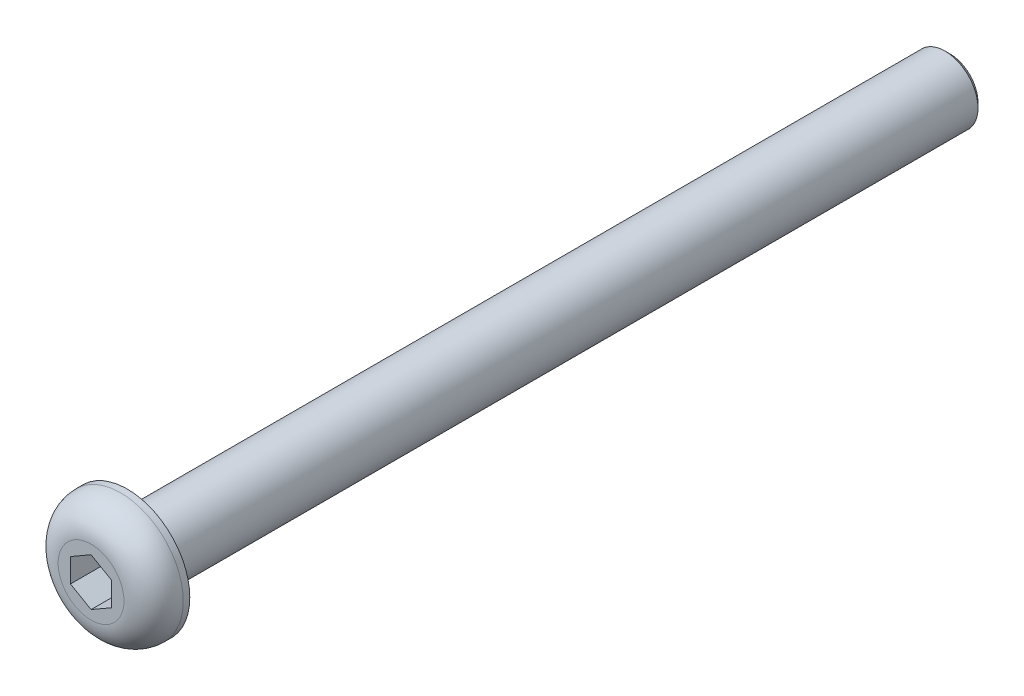
ISO-10303-21;
HEADER;
FILE_DESCRIPTION(('STEP AP214'),'2;1');
FILE_NAME('part.step','',(''),(''),'','','');
FILE_SCHEMA(('AUTOMOTIVE_DESIGN { 1 0 10303 214 1 1 1 1 }'));
ENDSEC;
DATA;
#1=APPLICATION_CONTEXT('core data for automotive mechanical design processes');
#2=APPLICATION_PROTOCOL_DEFINITION('international standard','automotive_design',2000,#1);
#3=PRODUCT_CONTEXT('',#1,'mechanical');
#4=PRODUCT('Part','Part','',(#3));
#5=PRODUCT_RELATED_PRODUCT_CATEGORY('part','',(#4));
#6=PRODUCT_DEFINITION_FORMATION('','',#4);
#7=PRODUCT_DEFINITION_CONTEXT('part definition',#1,'design');
#8=PRODUCT_DEFINITION('design','',#6,#7);
#9=PRODUCT_DEFINITION_SHAPE('','',#8);
#10=(LENGTH_UNIT() NAMED_UNIT(*) SI_UNIT(.MILLI.,.METRE.));
#11=(NAMED_UNIT(*) PLANE_ANGLE_UNIT() SI_UNIT($,.RADIAN.));
#12=(NAMED_UNIT(*) SI_UNIT($,.STERADIAN.) SOLID_ANGLE_UNIT());
#13=UNCERTAINTY_MEASURE_WITH_UNIT(LENGTH_MEASURE(1.E-05),#10,'distance_accuracy_value','');
#14=(GEOMETRIC_REPRESENTATION_CONTEXT(3) GLOBAL_UNCERTAINTY_ASSIGNED_CONTEXT((#13)) GLOBAL_UNIT_ASSIGNED_CONTEXT((#10,
#11,#12)) REPRESENTATION_CONTEXT('',''));
#15=CARTESIAN_POINT('',(0.,0.,0.));
#16=DIRECTION('',(0.,0.,1.));
#17=DIRECTION('',(1.,0.,0.));
#18=AXIS2_PLACEMENT_3D('',#15,#16,#17);
#19=CARTESIAN_POINT('',(0.,0.,0.));
#20=DIRECTION('',(0.,0.,1.));
#21=DIRECTION('',(1.,0.,0.));
#22=AXIS2_PLACEMENT_3D('',#19,#20,#21);
#23=PLANE('',#22);
#24=CARTESIAN_POINT('',(0.,0.,0.));
#25=DIRECTION('',(0.,0.,1.));
#26=DIRECTION('',(1.,0.,0.));
#27=AXIS2_PLACEMENT_3D('',#24,#25,#26);
#28=CIRCLE('',#27,3.8);
#29=CARTESIAN_POINT('',(3.8,0.,0.));
#30=VERTEX_POINT('',#29);
#31=EDGE_CURVE('E138',#30,#30,#28,.T.);
#32=ORIENTED_EDGE('',*,*,#31,.F.);
#33=EDGE_LOOP('',(#32));
#34=FACE_BOUND('',#33,.T.);
#35=CARTESIAN_POINT('',(0.,0.,0.));
#36=DIRECTION('',(0.,0.,1.));
#37=DIRECTION('',(1.,0.,0.));
#38=AXIS2_PLACEMENT_3D('',#35,#36,#37);
#39=CIRCLE('',#38,2.);
#40=CARTESIAN_POINT('',(2.,0.,0.));
#41=VERTEX_POINT('',#40);
#42=EDGE_CURVE('E146',#41,#41,#39,.F.);
#43=ORIENTED_EDGE('',*,*,#42,.F.);
#44=EDGE_LOOP('',(#43));
#45=FACE_BOUND('',#44,.T.);
#46=ADVANCED_FACE('F36',(#34,#45),#23,.F.);
#47=CARTESIAN_POINT('',(0.,0.,2.2));
#48=DIRECTION('',(0.,0.,-1.));
#49=DIRECTION('',(-1.,0.,0.));
#50=AXIS2_PLACEMENT_3D('',#47,#48,#49);
#51=CYLINDRICAL_SURFACE('',#50,3.8);
#52=CARTESIAN_POINT('',(0.,0.,0.4));
#53=DIRECTION('',(0.,0.,1.));
#54=DIRECTION('',(1.,0.,0.));
#55=AXIS2_PLACEMENT_3D('',#52,#53,#54);
#56=CIRCLE('',#55,3.8);
#57=CARTESIAN_POINT('',(3.8,0.,0.4));
#58=VERTEX_POINT('',#57);
#59=EDGE_CURVE('E11',#58,#58,#56,.F.);
#60=ORIENTED_EDGE('',*,*,#59,.T.);
#61=EDGE_LOOP('',(#60));
#62=FACE_BOUND('',#61,.T.);
#63=ORIENTED_EDGE('',*,*,#31,.T.);
#64=EDGE_LOOP('',(#63));
#65=FACE_BOUND('',#64,.T.);
#66=ADVANCED_FACE('F169',(#62,#65),#51,.T.);
#67=CARTESIAN_POINT('',(0.,0.,2.2));
#68=DIRECTION('',(0.,0.,1.));
#69=DIRECTION('',(1.,0.,0.));
#70=AXIS2_PLACEMENT_3D('',#67,#68,#69);
#71=PLANE('',#70);
#72=CARTESIAN_POINT('',(0.,0.,2.2));
#73=DIRECTION('',(0.,0.,1.));
#74=DIRECTION('',(1.,0.,0.));
#75=AXIS2_PLACEMENT_3D('',#72,#73,#74);
#76=CIRCLE('',#75,2.);
#77=CARTESIAN_POINT('',(2.,0.,2.2));
#78=VERTEX_POINT('',#77);
#79=EDGE_CURVE('E44',#78,#78,#76,.T.);
#80=ORIENTED_EDGE('',*,*,#79,.T.);
#81=EDGE_LOOP('',(#80));
#82=FACE_BOUND('',#81,.T.);
#83=DIRECTION('',(-0.866025403784439,0.5,0.));
#84=VECTOR('',#83,1.);
#85=CARTESIAN_POINT('',(1.25,0.721687836487033,2.2));
#86=LINE('',#85,#84);
#87=CARTESIAN_POINT('',(1.25,0.721687836487033,2.2));
#88=VERTEX_POINT('',#87);
#89=CARTESIAN_POINT('',(0.,1.44337567297406,2.2));
#90=VERTEX_POINT('',#89);
#91=EDGE_CURVE('E51',#88,#90,#86,.T.);
#92=ORIENTED_EDGE('',*,*,#91,.F.);
#93=DIRECTION('',(0.,1.,0.));
#94=VECTOR('',#93,1.);
#95=CARTESIAN_POINT('',(1.25,-0.721687836487033,2.2));
#96=LINE('',#95,#94);
#97=CARTESIAN_POINT('',(1.25,-0.721687836487033,2.2));
#98=VERTEX_POINT('',#97);
#99=EDGE_CURVE('E134',#98,#88,#96,.T.);
#100=ORIENTED_EDGE('',*,*,#99,.F.);
#101=DIRECTION('',(0.866025403784439,0.5,0.));
#102=VECTOR('',#101,1.);
#103=CARTESIAN_POINT('',(0.,-1.44337567297406,2.2));
#104=LINE('',#103,#102);
#105=CARTESIAN_POINT('',(0.,-1.44337567297406,2.2));
#106=VERTEX_POINT('',#105);
#107=EDGE_CURVE('E132',#106,#98,#104,.T.);
#108=ORIENTED_EDGE('',*,*,#107,.F.);
#109=DIRECTION('',(0.866025403784439,-0.5,0.));
#110=VECTOR('',#109,1.);
#111=CARTESIAN_POINT('',(-1.25,-0.721687836487032,2.2));
#112=LINE('',#111,#110);
#113=CARTESIAN_POINT('',(-1.25,-0.721687836487032,2.2));
#114=VERTEX_POINT('',#113);
#115=EDGE_CURVE('E99',#114,#106,#112,.T.);
#116=ORIENTED_EDGE('',*,*,#115,.F.);
#117=DIRECTION('',(0.,-1.,0.));
#118=VECTOR('',#117,1.);
#119=CARTESIAN_POINT('',(-1.25,0.721687836487033,2.2));
#120=LINE('',#119,#118);
#121=CARTESIAN_POINT('',(-1.25,0.721687836487033,2.2));
#122=VERTEX_POINT('',#121);
#123=EDGE_CURVE('E128',#122,#114,#120,.T.);
#124=ORIENTED_EDGE('',*,*,#123,.F.);
#125=DIRECTION('',(-0.866025403784439,-0.5,0.));
#126=VECTOR('',#125,1.);
#127=CARTESIAN_POINT('',(0.,1.44337567297406,2.2));
#128=LINE('',#127,#126);
#129=EDGE_CURVE('E125',#90,#122,#128,.T.);
#130=ORIENTED_EDGE('',*,*,#129,.F.);
#131=EDGE_LOOP('',(#92,#100,#108,#116,#124,#130));
#132=FACE_BOUND('',#131,.T.);
#133=ADVANCED_FACE('F157',(#82,#132),#71,.T.);
#134=CARTESIAN_POINT('',(0.,0.,-50.));
#135=DIRECTION('',(0.,0.,1.));
#136=DIRECTION('',(1.,0.,0.));
#137=AXIS2_PLACEMENT_3D('',#134,#135,#136);
#138=CYLINDRICAL_SURFACE('',#137,2.);
#139=CARTESIAN_POINT('',(0.,0.,-49.7));
#140=DIRECTION('',(0.,0.,-1.));
#141=DIRECTION('',(-1.,0.,0.));
#142=AXIS2_PLACEMENT_3D('',#139,#140,#141);
#143=CIRCLE('',#142,2.);
#144=CARTESIAN_POINT('',(-2.,0.,-49.7));
#145=VERTEX_POINT('',#144);
#146=EDGE_CURVE('E152',#145,#145,#143,.F.);
#147=ORIENTED_EDGE('',*,*,#146,.T.);
#148=EDGE_LOOP('',(#147));
#149=FACE_BOUND('',#148,.T.);
#150=ORIENTED_EDGE('',*,*,#42,.T.);
#151=EDGE_LOOP('',(#150));
#152=FACE_BOUND('',#151,.T.);
#153=ADVANCED_FACE('F192',(#149,#152),#138,.T.);
#154=CARTESIAN_POINT('',(0.,0.,-50.));
#155=DIRECTION('',(0.,0.,-1.));
#156=DIRECTION('',(-1.,0.,0.));
#157=AXIS2_PLACEMENT_3D('',#154,#155,#156);
#158=PLANE('',#157);
#159=CARTESIAN_POINT('',(0.,0.,-50.));
#160=DIRECTION('',(0.,0.,-1.));
#161=DIRECTION('',(-1.,0.,0.));
#162=AXIS2_PLACEMENT_3D('',#159,#160,#161);
#163=CIRCLE('',#162,1.7);
#164=CARTESIAN_POINT('',(-1.7,0.,-50.));
#165=VERTEX_POINT('',#164);
#166=EDGE_CURVE('E149',#165,#165,#163,.T.);
#167=ORIENTED_EDGE('',*,*,#166,.T.);
#168=EDGE_LOOP('',(#167));
#169=FACE_BOUND('',#168,.T.);
#170=ADVANCED_FACE('F184',(#169),#158,.T.);
#171=CARTESIAN_POINT('',(0.,0.,-50.));
#172=DIRECTION('',(0.,0.,1.));
#173=DIRECTION('',(1.,0.,0.));
#174=AXIS2_PLACEMENT_3D('',#171,#172,#173);
#175=CONICAL_SURFACE('',#174,1.7,0.785398163397457);
#176=ORIENTED_EDGE('',*,*,#146,.F.);
#177=EDGE_LOOP('',(#176));
#178=FACE_BOUND('',#177,.T.);
#179=ORIENTED_EDGE('',*,*,#166,.F.);
#180=EDGE_LOOP('',(#179));
#181=FACE_BOUND('',#180,.T.);
#182=ADVANCED_FACE('F181',(#178,#181),#175,.T.);
#183=CARTESIAN_POINT('',(1.25,0.721687836487033,0.2));
#184=DIRECTION('',(0.5,0.866025403784439,0.));
#185=DIRECTION('',(-0.866025403784439,0.5,0.));
#186=AXIS2_PLACEMENT_3D('',#183,#184,#185);
#187=PLANE('',#186);
#188=ORIENTED_EDGE('',*,*,#91,.T.);
#189=DIRECTION('',(0.,0.,1.));
#190=VECTOR('',#189,1.);
#191=CARTESIAN_POINT('',(0.,1.44337567297406,0.2));
#192=LINE('',#191,#190);
#193=CARTESIAN_POINT('',(0.,1.44337567297406,0.2));
#194=VERTEX_POINT('',#193);
#195=EDGE_CURVE('E81',#194,#90,#192,.T.);
#196=ORIENTED_EDGE('',*,*,#195,.F.);
#197=DIRECTION('',(-0.866025403784439,0.5,0.));
#198=VECTOR('',#197,1.);
#199=CARTESIAN_POINT('',(1.25,0.721687836487033,0.2));
#200=LINE('',#199,#198);
#201=CARTESIAN_POINT('',(1.25,0.721687836487033,0.2));
#202=VERTEX_POINT('',#201);
#203=EDGE_CURVE('E136',#202,#194,#200,.T.);
#204=ORIENTED_EDGE('',*,*,#203,.F.);
#205=DIRECTION('',(0.,0.,1.));
#206=VECTOR('',#205,1.);
#207=CARTESIAN_POINT('',(1.25,0.721687836487033,0.2));
#208=LINE('',#207,#206);
#209=EDGE_CURVE('E59',#202,#88,#208,.T.);
#210=ORIENTED_EDGE('',*,*,#209,.T.);
#211=EDGE_LOOP('',(#188,#196,#204,#210));
#212=FACE_BOUND('',#211,.T.);
#213=ADVANCED_FACE('F183',(#212),#187,.F.);
#214=CARTESIAN_POINT('',(1.25,-0.721687836487033,0.2));
#215=DIRECTION('',(1.,0.,0.));
#216=DIRECTION('',(0.,1.,0.));
#217=AXIS2_PLACEMENT_3D('',#214,#215,#216);
#218=PLANE('',#217);
#219=ORIENTED_EDGE('',*,*,#99,.T.);
#220=ORIENTED_EDGE('',*,*,#209,.F.);
#221=DIRECTION('',(0.,1.,0.));
#222=VECTOR('',#221,1.);
#223=CARTESIAN_POINT('',(1.25,-0.721687836487033,0.2));
#224=LINE('',#223,#222);
#225=CARTESIAN_POINT('',(1.25,-0.721687836487033,0.2));
#226=VERTEX_POINT('',#225);
#227=EDGE_CURVE('E111',#226,#202,#224,.T.);
#228=ORIENTED_EDGE('',*,*,#227,.F.);
#229=DIRECTION('',(0.,0.,1.));
#230=VECTOR('',#229,1.);
#231=CARTESIAN_POINT('',(1.25,-0.721687836487033,0.2));
#232=LINE('',#231,#230);
#233=EDGE_CURVE('E103',#226,#98,#232,.T.);
#234=ORIENTED_EDGE('',*,*,#233,.T.);
#235=EDGE_LOOP('',(#219,#220,#228,#234));
#236=FACE_BOUND('',#235,.T.);
#237=ADVANCED_FACE('F190',(#236),#218,.F.);
#238=CARTESIAN_POINT('',(0.,-1.44337567297406,0.2));
#239=DIRECTION('',(0.5,-0.866025403784439,0.));
#240=DIRECTION('',(0.866025403784439,0.5,0.));
#241=AXIS2_PLACEMENT_3D('',#238,#239,#240);
#242=PLANE('',#241);
#243=ORIENTED_EDGE('',*,*,#107,.T.);
#244=ORIENTED_EDGE('',*,*,#233,.F.);
#245=DIRECTION('',(0.866025403784439,0.5,0.));
#246=VECTOR('',#245,1.);
#247=CARTESIAN_POINT('',(0.,-1.44337567297406,0.2));
#248=LINE('',#247,#246);
#249=CARTESIAN_POINT('',(0.,-1.44337567297406,0.2));
#250=VERTEX_POINT('',#249);
#251=EDGE_CURVE('E107',#250,#226,#248,.T.);
#252=ORIENTED_EDGE('',*,*,#251,.F.);
#253=DIRECTION('',(0.,0.,1.));
#254=VECTOR('',#253,1.);
#255=CARTESIAN_POINT('',(0.,-1.44337567297406,0.2));
#256=LINE('',#255,#254);
#257=EDGE_CURVE('E92',#250,#106,#256,.T.);
#258=ORIENTED_EDGE('',*,*,#257,.T.);
#259=EDGE_LOOP('',(#243,#244,#252,#258));
#260=FACE_BOUND('',#259,.T.);
#261=ADVANCED_FACE('F108',(#260),#242,.F.);
#262=CARTESIAN_POINT('',(-1.25,-0.721687836487032,0.2));
#263=DIRECTION('',(-0.5,-0.866025403784439,0.));
#264=DIRECTION('',(0.866025403784439,-0.5,0.));
#265=AXIS2_PLACEMENT_3D('',#262,#263,#264);
#266=PLANE('',#265);
#267=ORIENTED_EDGE('',*,*,#115,.T.);
#268=ORIENTED_EDGE('',*,*,#257,.F.);
#269=DIRECTION('',(0.866025403784439,-0.5,0.));
#270=VECTOR('',#269,1.);
#271=CARTESIAN_POINT('',(-1.25,-0.721687836487032,0.2));
#272=LINE('',#271,#270);
#273=CARTESIAN_POINT('',(-1.25,-0.721687836487032,0.2));
#274=VERTEX_POINT('',#273);
#275=EDGE_CURVE('E96',#274,#250,#272,.T.);
#276=ORIENTED_EDGE('',*,*,#275,.F.);
#277=DIRECTION('',(0.,0.,1.));
#278=VECTOR('',#277,1.);
#279=CARTESIAN_POINT('',(-1.25,-0.721687836487032,0.2));
#280=LINE('',#279,#278);
#281=EDGE_CURVE('E104',#274,#114,#280,.T.);
#282=ORIENTED_EDGE('',*,*,#281,.T.);
#283=EDGE_LOOP('',(#267,#268,#276,#282));
#284=FACE_BOUND('',#283,.T.);
#285=ADVANCED_FACE('F94',(#284),#266,.F.);
#286=CARTESIAN_POINT('',(-1.25,0.721687836487033,0.2));
#287=DIRECTION('',(-1.,0.,0.));
#288=DIRECTION('',(0.,0.,1.));
#289=AXIS2_PLACEMENT_3D('',#286,#287,#288);
#290=PLANE('',#289);
#291=ORIENTED_EDGE('',*,*,#123,.T.);
#292=ORIENTED_EDGE('',*,*,#281,.F.);
#293=DIRECTION('',(0.,-1.,0.));
#294=VECTOR('',#293,1.);
#295=CARTESIAN_POINT('',(-1.25,0.721687836487033,0.2));
#296=LINE('',#295,#294);
#297=CARTESIAN_POINT('',(-1.25,0.721687836487033,0.2));
#298=VERTEX_POINT('',#297);
#299=EDGE_CURVE('E117',#298,#274,#296,.T.);
#300=ORIENTED_EDGE('',*,*,#299,.F.);
#301=DIRECTION('',(0.,0.,1.));
#302=VECTOR('',#301,1.);
#303=CARTESIAN_POINT('',(-1.25,0.721687836487033,0.2));
#304=LINE('',#303,#302);
#305=EDGE_CURVE('E141',#298,#122,#304,.T.);
#306=ORIENTED_EDGE('',*,*,#305,.T.);
#307=EDGE_LOOP('',(#291,#292,#300,#306));
#308=FACE_BOUND('',#307,.T.);
#309=ADVANCED_FACE('F208',(#308),#290,.F.);
#310=CARTESIAN_POINT('',(0.,1.44337567297406,0.2));
#311=DIRECTION('',(-0.5,0.866025403784439,0.));
#312=DIRECTION('',(-0.866025403784439,-0.5,0.));
#313=AXIS2_PLACEMENT_3D('',#310,#311,#312);
#314=PLANE('',#313);
#315=ORIENTED_EDGE('',*,*,#129,.T.);
#316=ORIENTED_EDGE('',*,*,#305,.F.);
#317=DIRECTION('',(-0.866025403784439,-0.5,0.));
#318=VECTOR('',#317,1.);
#319=CARTESIAN_POINT('',(0.,1.44337567297406,0.2));
#320=LINE('',#319,#318);
#321=EDGE_CURVE('E119',#194,#298,#320,.T.);
#322=ORIENTED_EDGE('',*,*,#321,.F.);
#323=ORIENTED_EDGE('',*,*,#195,.T.);
#324=EDGE_LOOP('',(#315,#316,#322,#323));
#325=FACE_BOUND('',#324,.T.);
#326=ADVANCED_FACE('F165',(#325),#314,.F.);
#327=CARTESIAN_POINT('',(0.,0.,0.2));
#328=DIRECTION('',(0.,0.,1.));
#329=DIRECTION('',(1.,0.,0.));
#330=AXIS2_PLACEMENT_3D('',#327,#328,#329);
#331=PLANE('',#330);
#332=ORIENTED_EDGE('',*,*,#203,.T.);
#333=ORIENTED_EDGE('',*,*,#321,.T.);
#334=ORIENTED_EDGE('',*,*,#299,.T.);
#335=ORIENTED_EDGE('',*,*,#275,.T.);
#336=ORIENTED_EDGE('',*,*,#251,.T.);
#337=ORIENTED_EDGE('',*,*,#227,.T.);
#338=EDGE_LOOP('',(#332,#333,#334,#335,#336,#337));
#339=FACE_BOUND('',#338,.T.);
#340=ADVANCED_FACE('F114',(#339),#331,.T.);
#341=CARTESIAN_POINT('',(0.,0.,0.4));
#342=DIRECTION('',(0.,0.,1.));
#343=DIRECTION('',(1.,0.,0.));
#344=AXIS2_PLACEMENT_3D('',#341,#342,#343);
#345=TOROIDAL_SURFACE('',#344,2.,1.8);
#346=ORIENTED_EDGE('',*,*,#59,.F.);
#347=EDGE_LOOP('',(#346));
#348=FACE_BOUND('',#347,.T.);
#349=ORIENTED_EDGE('',*,*,#79,.F.);
#350=EDGE_LOOP('',(#349));
#351=FACE_BOUND('',#350,.T.);
#352=ADVANCED_FACE('F38',(#348,#351),#345,.T.);
#353=CLOSED_SHELL('',(#46,#66,#133,#153,#170,#182,#213,#237,#261,#285,#309,#326,#340,#352));
#354=MANIFOLD_SOLID_BREP('B2',#353);
#355=ADVANCED_BREP_SHAPE_REPRESENTATION('',(#18,#354),#14);
#356=SHAPE_DEFINITION_REPRESENTATION(#9,#355);
ENDSEC;
END-ISO-10303-21;
